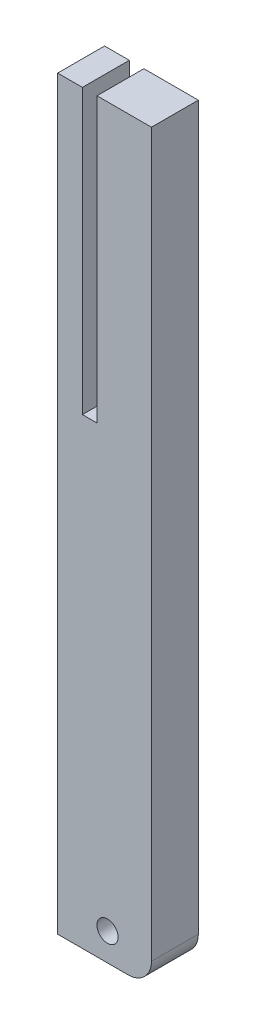
ISO-10303-21;
HEADER;
FILE_DESCRIPTION(('STEP AP214'),'2;1');
FILE_NAME('part.step','',(''),(''),'','','');
FILE_SCHEMA(('AUTOMOTIVE_DESIGN { 1 0 10303 214 1 1 1 1 }'));
ENDSEC;
DATA;
#1=APPLICATION_CONTEXT('core data for automotive mechanical design processes');
#2=APPLICATION_PROTOCOL_DEFINITION('international standard','automotive_design',2000,#1);
#3=PRODUCT_CONTEXT('',#1,'mechanical');
#4=PRODUCT('Part','Part','',(#3));
#5=PRODUCT_RELATED_PRODUCT_CATEGORY('part','',(#4));
#6=PRODUCT_DEFINITION_FORMATION('','',#4);
#7=PRODUCT_DEFINITION_CONTEXT('part definition',#1,'design');
#8=PRODUCT_DEFINITION('design','',#6,#7);
#9=PRODUCT_DEFINITION_SHAPE('','',#8);
#10=(LENGTH_UNIT() NAMED_UNIT(*) SI_UNIT(.MILLI.,.METRE.));
#11=(NAMED_UNIT(*) PLANE_ANGLE_UNIT() SI_UNIT($,.RADIAN.));
#12=(NAMED_UNIT(*) SI_UNIT($,.STERADIAN.) SOLID_ANGLE_UNIT());
#13=UNCERTAINTY_MEASURE_WITH_UNIT(LENGTH_MEASURE(1.E-05),#10,'distance_accuracy_value','');
#14=(GEOMETRIC_REPRESENTATION_CONTEXT(3) GLOBAL_UNCERTAINTY_ASSIGNED_CONTEXT((#13)) GLOBAL_UNIT_ASSIGNED_CONTEXT((#10,
#11,#12)) REPRESENTATION_CONTEXT('',''));
#15=CARTESIAN_POINT('',(0.,0.,0.));
#16=DIRECTION('',(0.,0.,1.));
#17=DIRECTION('',(1.,0.,0.));
#18=AXIS2_PLACEMENT_3D('',#15,#16,#17);
#19=CARTESIAN_POINT('',(1.84322456762231,74.0013387315344,5.08));
#20=DIRECTION('',(0.,-1.,0.));
#21=DIRECTION('',(0.,0.,-1.));
#22=AXIS2_PLACEMENT_3D('',#19,#20,#21);
#23=PLANE('',#22);
#24=DIRECTION('',(-1.,0.,0.));
#25=VECTOR('',#24,1.);
#26=CARTESIAN_POINT('',(1.84322456762231,74.0013387315344,5.08));
#27=LINE('',#26,#25);
#28=CARTESIAN_POINT('',(-5.63562525796524,74.0013387315344,5.08));
#29=VERTEX_POINT('',#28);
#30=CARTESIAN_POINT('',(-8.31677543237769,74.0013387315344,5.08));
#31=VERTEX_POINT('',#30);
#32=EDGE_CURVE('E156',#29,#31,#27,.T.);
#33=ORIENTED_EDGE('',*,*,#32,.F.);
#34=DIRECTION('',(0.,0.,1.));
#35=VECTOR('',#34,1.);
#36=CARTESIAN_POINT('',(-5.63562525796524,74.0013387315344,0.));
#37=LINE('',#36,#35);
#38=CARTESIAN_POINT('',(-5.63562525796524,74.0013387315344,0.));
#39=VERTEX_POINT('',#38);
#40=EDGE_CURVE('E136',#39,#29,#37,.T.);
#41=ORIENTED_EDGE('',*,*,#40,.F.);
#42=DIRECTION('',(-1.,0.,0.));
#43=VECTOR('',#42,1.);
#44=CARTESIAN_POINT('',(1.84322456762231,74.0013387315344,0.));
#45=LINE('',#44,#43);
#46=CARTESIAN_POINT('',(-8.31677543237769,74.0013387315344,0.));
#47=VERTEX_POINT('',#46);
#48=EDGE_CURVE('E126',#39,#47,#45,.T.);
#49=ORIENTED_EDGE('',*,*,#48,.T.);
#50=DIRECTION('',(0.,0.,-1.));
#51=VECTOR('',#50,1.);
#52=CARTESIAN_POINT('',(-8.31677543237769,74.0013387315344,5.08));
#53=LINE('',#52,#51);
#54=EDGE_CURVE('E160',#31,#47,#53,.T.);
#55=ORIENTED_EDGE('',*,*,#54,.F.);
#56=EDGE_LOOP('',(#33,#41,#49,#55));
#57=FACE_BOUND('',#56,.T.);
#58=ADVANCED_FACE('F35',(#57),#23,.F.);
#59=CARTESIAN_POINT('',(-8.31677543237769,74.0013387315344,5.08));
#60=DIRECTION('',(1.,0.,0.));
#61=DIRECTION('',(0.,1.,0.));
#62=AXIS2_PLACEMENT_3D('',#59,#60,#61);
#63=PLANE('',#62);
#64=DIRECTION('',(0.,-1.,0.));
#65=VECTOR('',#64,1.);
#66=CARTESIAN_POINT('',(-8.31677543237769,74.0013387315344,0.));
#67=LINE('',#66,#65);
#68=CARTESIAN_POINT('',(-8.31677543237767,-6.79933779545649,0.));
#69=VERTEX_POINT('',#68);
#70=EDGE_CURVE('E138',#47,#69,#67,.T.);
#71=ORIENTED_EDGE('',*,*,#70,.T.);
#72=DIRECTION('',(0.,0.,-1.));
#73=VECTOR('',#72,1.);
#74=CARTESIAN_POINT('',(-8.31677543237767,-6.79933779545649,5.08));
#75=LINE('',#74,#73);
#76=CARTESIAN_POINT('',(-8.31677543237767,-6.79933779545649,5.08));
#77=VERTEX_POINT('',#76);
#78=EDGE_CURVE('E174',#77,#69,#75,.T.);
#79=ORIENTED_EDGE('',*,*,#78,.F.);
#80=DIRECTION('',(0.,-1.,0.));
#81=VECTOR('',#80,1.);
#82=CARTESIAN_POINT('',(-8.31677543237769,74.0013387315344,5.08));
#83=LINE('',#82,#81);
#84=EDGE_CURVE('E148',#31,#77,#83,.T.);
#85=ORIENTED_EDGE('',*,*,#84,.F.);
#86=ORIENTED_EDGE('',*,*,#54,.T.);
#87=EDGE_LOOP('',(#71,#79,#85,#86));
#88=FACE_BOUND('',#87,.T.);
#89=ADVANCED_FACE('F210',(#88),#63,.F.);
#90=CARTESIAN_POINT('',(-8.31677543237767,-6.79933779545649,5.08));
#91=DIRECTION('',(0.,1.,0.));
#92=DIRECTION('',(0.,0.,1.));
#93=AXIS2_PLACEMENT_3D('',#90,#91,#92);
#94=PLANE('',#93);
#95=DIRECTION('',(1.,0.,0.));
#96=VECTOR('',#95,1.);
#97=CARTESIAN_POINT('',(-8.31677543237767,-6.79933779545649,0.));
#98=LINE('',#97,#96);
#99=CARTESIAN_POINT('',(-0.696775432377688,-6.79933779545649,0.));
#100=VERTEX_POINT('',#99);
#101=EDGE_CURVE('E163',#69,#100,#98,.T.);
#102=ORIENTED_EDGE('',*,*,#101,.T.);
#103=DIRECTION('',(0.,0.,-1.));
#104=VECTOR('',#103,1.);
#105=CARTESIAN_POINT('',(-0.696775432377686,-6.79933779545649,5.08));
#106=LINE('',#105,#104);
#107=CARTESIAN_POINT('',(-0.696775432377688,-6.79933779545649,5.08));
#108=VERTEX_POINT('',#107);
#109=EDGE_CURVE('E43',#100,#108,#106,.F.);
#110=ORIENTED_EDGE('',*,*,#109,.T.);
#111=DIRECTION('',(1.,0.,0.));
#112=VECTOR('',#111,1.);
#113=CARTESIAN_POINT('',(-8.31677543237767,-6.79933779545649,5.08));
#114=LINE('',#113,#112);
#115=EDGE_CURVE('E151',#77,#108,#114,.T.);
#116=ORIENTED_EDGE('',*,*,#115,.F.);
#117=ORIENTED_EDGE('',*,*,#78,.T.);
#118=EDGE_LOOP('',(#102,#110,#116,#117));
#119=FACE_BOUND('',#118,.T.);
#120=ADVANCED_FACE('F185',(#119),#94,.F.);
#121=CARTESIAN_POINT('',(1.84322456762231,-6.79933779545649,5.08));
#122=DIRECTION('',(-1.,0.,0.));
#123=DIRECTION('',(0.,0.,1.));
#124=AXIS2_PLACEMENT_3D('',#121,#122,#123);
#125=PLANE('',#124);
#126=DIRECTION('',(0.,1.,0.));
#127=VECTOR('',#126,1.);
#128=CARTESIAN_POINT('',(1.84322456762231,-6.79933779545649,5.08));
#129=LINE('',#128,#127);
#130=CARTESIAN_POINT('',(1.84322456762231,-4.25933779545649,5.08));
#131=VERTEX_POINT('',#130);
#132=CARTESIAN_POINT('',(1.84322456762231,74.0013387315344,5.08));
#133=VERTEX_POINT('',#132);
#134=EDGE_CURVE('E154',#131,#133,#129,.T.);
#135=ORIENTED_EDGE('',*,*,#134,.F.);
#136=DIRECTION('',(0.,0.,-1.));
#137=VECTOR('',#136,1.);
#138=CARTESIAN_POINT('',(1.84322456762231,-4.25933779545649,5.08));
#139=LINE('',#138,#137);
#140=CARTESIAN_POINT('',(1.84322456762231,-4.25933779545649,0.));
#141=VERTEX_POINT('',#140);
#142=EDGE_CURVE('E177',#131,#141,#139,.T.);
#143=ORIENTED_EDGE('',*,*,#142,.T.);
#144=DIRECTION('',(0.,1.,0.));
#145=VECTOR('',#144,1.);
#146=CARTESIAN_POINT('',(1.84322456762231,-6.79933779545649,0.));
#147=LINE('',#146,#145);
#148=CARTESIAN_POINT('',(1.84322456762231,74.0013387315344,0.));
#149=VERTEX_POINT('',#148);
#150=EDGE_CURVE('E165',#141,#149,#147,.T.);
#151=ORIENTED_EDGE('',*,*,#150,.T.);
#152=DIRECTION('',(0.,0.,-1.));
#153=VECTOR('',#152,1.);
#154=CARTESIAN_POINT('',(1.84322456762231,74.0013387315344,5.08));
#155=LINE('',#154,#153);
#156=EDGE_CURVE('E171',#133,#149,#155,.T.);
#157=ORIENTED_EDGE('',*,*,#156,.F.);
#158=EDGE_LOOP('',(#135,#143,#151,#157));
#159=FACE_BOUND('',#158,.T.);
#160=ADVANCED_FACE('F194',(#159),#125,.F.);
#161=CARTESIAN_POINT('',(-4.05623598693073,74.0013387315344,0.));
#162=VERTEX_POINT('',#161);
#163=EDGE_CURVE('E152',#149,#162,#45,.T.);
#164=ORIENTED_EDGE('',*,*,#163,.T.);
#165=DIRECTION('',(0.,0.,1.));
#166=VECTOR('',#165,1.);
#167=CARTESIAN_POINT('',(-4.05623598693073,74.0013387315344,0.));
#168=LINE('',#167,#166);
#169=CARTESIAN_POINT('',(-4.05623598693073,74.0013387315344,5.08));
#170=VERTEX_POINT('',#169);
#171=EDGE_CURVE('E139',#162,#170,#168,.T.);
#172=ORIENTED_EDGE('',*,*,#171,.T.);
#173=EDGE_CURVE('E157',#133,#170,#27,.T.);
#174=ORIENTED_EDGE('',*,*,#173,.F.);
#175=ORIENTED_EDGE('',*,*,#156,.T.);
#176=EDGE_LOOP('',(#164,#172,#174,#175));
#177=FACE_BOUND('',#176,.T.);
#178=ADVANCED_FACE('F197',(#177),#23,.F.);
#179=CARTESIAN_POINT('',(0.,0.,5.08));
#180=DIRECTION('',(0.,0.,1.));
#181=DIRECTION('',(1.,0.,0.));
#182=AXIS2_PLACEMENT_3D('',#179,#180,#181);
#183=PLANE('',#182);
#184=DIRECTION('',(0.,-1.,0.));
#185=VECTOR('',#184,1.);
#186=CARTESIAN_POINT('',(-5.63562525796524,74.0013387315344,5.08));
#187=LINE('',#186,#185);
#188=CARTESIAN_POINT('',(-5.63562525796524,43.2965862666777,5.08));
#189=VERTEX_POINT('',#188);
#190=EDGE_CURVE('E111',#29,#189,#187,.T.);
#191=ORIENTED_EDGE('',*,*,#190,.F.);
#192=ORIENTED_EDGE('',*,*,#32,.T.);
#193=ORIENTED_EDGE('',*,*,#84,.T.);
#194=ORIENTED_EDGE('',*,*,#115,.T.);
#195=CARTESIAN_POINT('',(-0.696775432377685,-4.25933779545649,5.08));
#196=DIRECTION('',(0.,0.,1.));
#197=DIRECTION('',(1.,0.,0.));
#198=AXIS2_PLACEMENT_3D('',#195,#196,#197);
#199=CIRCLE('',#198,2.54);
#200=EDGE_CURVE('E11',#108,#131,#199,.T.);
#201=ORIENTED_EDGE('',*,*,#200,.T.);
#202=ORIENTED_EDGE('',*,*,#134,.T.);
#203=ORIENTED_EDGE('',*,*,#173,.T.);
#204=DIRECTION('',(0.,1.,0.));
#205=VECTOR('',#204,1.);
#206=CARTESIAN_POINT('',(-4.05623598693073,74.0013387315344,5.08));
#207=LINE('',#206,#205);
#208=CARTESIAN_POINT('',(-4.05623598693073,43.2965862666777,5.08));
#209=VERTEX_POINT('',#208);
#210=EDGE_CURVE('E127',#209,#170,#207,.T.);
#211=ORIENTED_EDGE('',*,*,#210,.F.);
#212=DIRECTION('',(1.,0.,0.));
#213=VECTOR('',#212,1.);
#214=CARTESIAN_POINT('',(-5.63562525796524,43.2965862666777,5.08));
#215=LINE('',#214,#213);
#216=EDGE_CURVE('E129',#189,#209,#215,.T.);
#217=ORIENTED_EDGE('',*,*,#216,.F.);
#218=EDGE_LOOP('',(#191,#192,#193,#194,#201,#202,#203,#211,#217));
#219=FACE_BOUND('',#218,.T.);
#220=CARTESIAN_POINT('',(-2.91512532278387,-3.81000000000006,5.08));
#221=DIRECTION('',(0.,0.,1.));
#222=DIRECTION('',(1.,0.,0.));
#223=AXIS2_PLACEMENT_3D('',#220,#221,#222);
#224=CIRCLE('',#223,1.14300000000001);
#225=CARTESIAN_POINT('',(-1.77212532278387,-3.81000000000006,5.08));
#226=VERTEX_POINT('',#225);
#227=EDGE_CURVE('E145',#226,#226,#224,.T.);
#228=ORIENTED_EDGE('',*,*,#227,.F.);
#229=EDGE_LOOP('',(#228));
#230=FACE_BOUND('',#229,.T.);
#231=ADVANCED_FACE('F190',(#219,#230),#183,.T.);
#232=CARTESIAN_POINT('',(0.,0.,0.));
#233=DIRECTION('',(0.,0.,1.));
#234=DIRECTION('',(1.,0.,0.));
#235=AXIS2_PLACEMENT_3D('',#232,#233,#234);
#236=PLANE('',#235);
#237=ORIENTED_EDGE('',*,*,#48,.F.);
#238=DIRECTION('',(0.,-1.,0.));
#239=VECTOR('',#238,1.);
#240=CARTESIAN_POINT('',(-5.63562525796524,74.0013387315344,0.));
#241=LINE('',#240,#239);
#242=CARTESIAN_POINT('',(-5.63562525796524,43.2965862666777,0.));
#243=VERTEX_POINT('',#242);
#244=EDGE_CURVE('E108',#39,#243,#241,.T.);
#245=ORIENTED_EDGE('',*,*,#244,.T.);
#246=DIRECTION('',(1.,0.,0.));
#247=VECTOR('',#246,1.);
#248=CARTESIAN_POINT('',(-5.63562525796524,43.2965862666777,0.));
#249=LINE('',#248,#247);
#250=CARTESIAN_POINT('',(-4.05623598693073,43.2965862666777,0.));
#251=VERTEX_POINT('',#250);
#252=EDGE_CURVE('E118',#243,#251,#249,.T.);
#253=ORIENTED_EDGE('',*,*,#252,.T.);
#254=DIRECTION('',(0.,1.,0.));
#255=VECTOR('',#254,1.);
#256=CARTESIAN_POINT('',(-4.05623598693073,74.0013387315344,0.));
#257=LINE('',#256,#255);
#258=EDGE_CURVE('E50',#251,#162,#257,.T.);
#259=ORIENTED_EDGE('',*,*,#258,.T.);
#260=ORIENTED_EDGE('',*,*,#163,.F.);
#261=ORIENTED_EDGE('',*,*,#150,.F.);
#262=CARTESIAN_POINT('',(-0.696775432377685,-4.25933779545649,0.));
#263=DIRECTION('',(0.,0.,1.));
#264=DIRECTION('',(1.,0.,0.));
#265=AXIS2_PLACEMENT_3D('',#262,#263,#264);
#266=CIRCLE('',#265,2.54);
#267=EDGE_CURVE('E180',#141,#100,#266,.F.);
#268=ORIENTED_EDGE('',*,*,#267,.T.);
#269=ORIENTED_EDGE('',*,*,#101,.F.);
#270=ORIENTED_EDGE('',*,*,#70,.F.);
#271=EDGE_LOOP('',(#237,#245,#253,#259,#260,#261,#268,#269,#270));
#272=FACE_BOUND('',#271,.T.);
#273=CARTESIAN_POINT('',(-2.91512532278387,-3.81000000000006,0.));
#274=DIRECTION('',(0.,0.,1.));
#275=DIRECTION('',(1.,0.,0.));
#276=AXIS2_PLACEMENT_3D('',#273,#274,#275);
#277=CIRCLE('',#276,1.14300000000001);
#278=CARTESIAN_POINT('',(-1.77212532278387,-3.81000000000006,0.));
#279=VERTEX_POINT('',#278);
#280=EDGE_CURVE('E134',#279,#279,#277,.T.);
#281=ORIENTED_EDGE('',*,*,#280,.T.);
#282=EDGE_LOOP('',(#281));
#283=FACE_BOUND('',#282,.T.);
#284=ADVANCED_FACE('F123',(#272,#283),#236,.F.);
#285=CARTESIAN_POINT('',(-0.696775432377685,-4.25933779545649,5.08));
#286=DIRECTION('',(0.,0.,-1.));
#287=DIRECTION('',(-1.,0.,0.));
#288=AXIS2_PLACEMENT_3D('',#285,#286,#287);
#289=CYLINDRICAL_SURFACE('',#288,2.54);
#290=ORIENTED_EDGE('',*,*,#200,.F.);
#291=ORIENTED_EDGE('',*,*,#109,.F.);
#292=ORIENTED_EDGE('',*,*,#267,.F.);
#293=ORIENTED_EDGE('',*,*,#142,.F.);
#294=EDGE_LOOP('',(#290,#291,#292,#293));
#295=FACE_BOUND('',#294,.T.);
#296=ADVANCED_FACE('F37',(#295),#289,.T.);
#297=CARTESIAN_POINT('',(-2.91512532278387,-3.81000000000006,0.));
#298=DIRECTION('',(0.,0.,1.));
#299=DIRECTION('',(1.,0.,0.));
#300=AXIS2_PLACEMENT_3D('',#297,#298,#299);
#301=CYLINDRICAL_SURFACE('',#300,1.14300000000001);
#302=ORIENTED_EDGE('',*,*,#280,.F.);
#303=EDGE_LOOP('',(#302));
#304=FACE_BOUND('',#303,.T.);
#305=ORIENTED_EDGE('',*,*,#227,.T.);
#306=EDGE_LOOP('',(#305));
#307=FACE_BOUND('',#306,.T.);
#308=ADVANCED_FACE('F207',(#304,#307),#301,.F.);
#309=CARTESIAN_POINT('',(-5.63562525796524,74.0013387315344,0.));
#310=DIRECTION('',(-1.,0.,0.));
#311=DIRECTION('',(0.,0.,1.));
#312=AXIS2_PLACEMENT_3D('',#309,#310,#311);
#313=PLANE('',#312);
#314=ORIENTED_EDGE('',*,*,#190,.T.);
#315=DIRECTION('',(0.,0.,1.));
#316=VECTOR('',#315,1.);
#317=CARTESIAN_POINT('',(-5.63562525796524,43.2965862666777,0.));
#318=LINE('',#317,#316);
#319=EDGE_CURVE('E104',#243,#189,#318,.T.);
#320=ORIENTED_EDGE('',*,*,#319,.F.);
#321=ORIENTED_EDGE('',*,*,#244,.F.);
#322=ORIENTED_EDGE('',*,*,#40,.T.);
#323=EDGE_LOOP('',(#314,#320,#321,#322));
#324=FACE_BOUND('',#323,.T.);
#325=ADVANCED_FACE('F106',(#324),#313,.F.);
#326=CARTESIAN_POINT('',(-4.05623598693073,74.0013387315344,0.));
#327=DIRECTION('',(1.,0.,0.));
#328=DIRECTION('',(0.,0.,-1.));
#329=AXIS2_PLACEMENT_3D('',#326,#327,#328);
#330=PLANE('',#329);
#331=ORIENTED_EDGE('',*,*,#210,.T.);
#332=ORIENTED_EDGE('',*,*,#171,.F.);
#333=ORIENTED_EDGE('',*,*,#258,.F.);
#334=DIRECTION('',(0.,0.,1.));
#335=VECTOR('',#334,1.);
#336=CARTESIAN_POINT('',(-4.05623598693073,43.2965862666777,0.));
#337=LINE('',#336,#335);
#338=EDGE_CURVE('E115',#251,#209,#337,.T.);
#339=ORIENTED_EDGE('',*,*,#338,.T.);
#340=EDGE_LOOP('',(#331,#332,#333,#339));
#341=FACE_BOUND('',#340,.T.);
#342=ADVANCED_FACE('F199',(#341),#330,.F.);
#343=CARTESIAN_POINT('',(-5.63562525796524,43.2965862666777,0.));
#344=DIRECTION('',(0.,-1.,0.));
#345=DIRECTION('',(0.,0.,-1.));
#346=AXIS2_PLACEMENT_3D('',#343,#344,#345);
#347=PLANE('',#346);
#348=ORIENTED_EDGE('',*,*,#216,.T.);
#349=ORIENTED_EDGE('',*,*,#338,.F.);
#350=ORIENTED_EDGE('',*,*,#252,.F.);
#351=ORIENTED_EDGE('',*,*,#319,.T.);
#352=EDGE_LOOP('',(#348,#349,#350,#351));
#353=FACE_BOUND('',#352,.T.);
#354=ADVANCED_FACE('F119',(#353),#347,.F.);
#355=CLOSED_SHELL('',(#58,#89,#120,#160,#178,#231,#284,#296,#308,#325,#342,#354));
#356=MANIFOLD_SOLID_BREP('B2',#355);
#357=ADVANCED_BREP_SHAPE_REPRESENTATION('',(#18,#356),#14);
#358=SHAPE_DEFINITION_REPRESENTATION(#9,#357);
ENDSEC;
END-ISO-10303-21;
